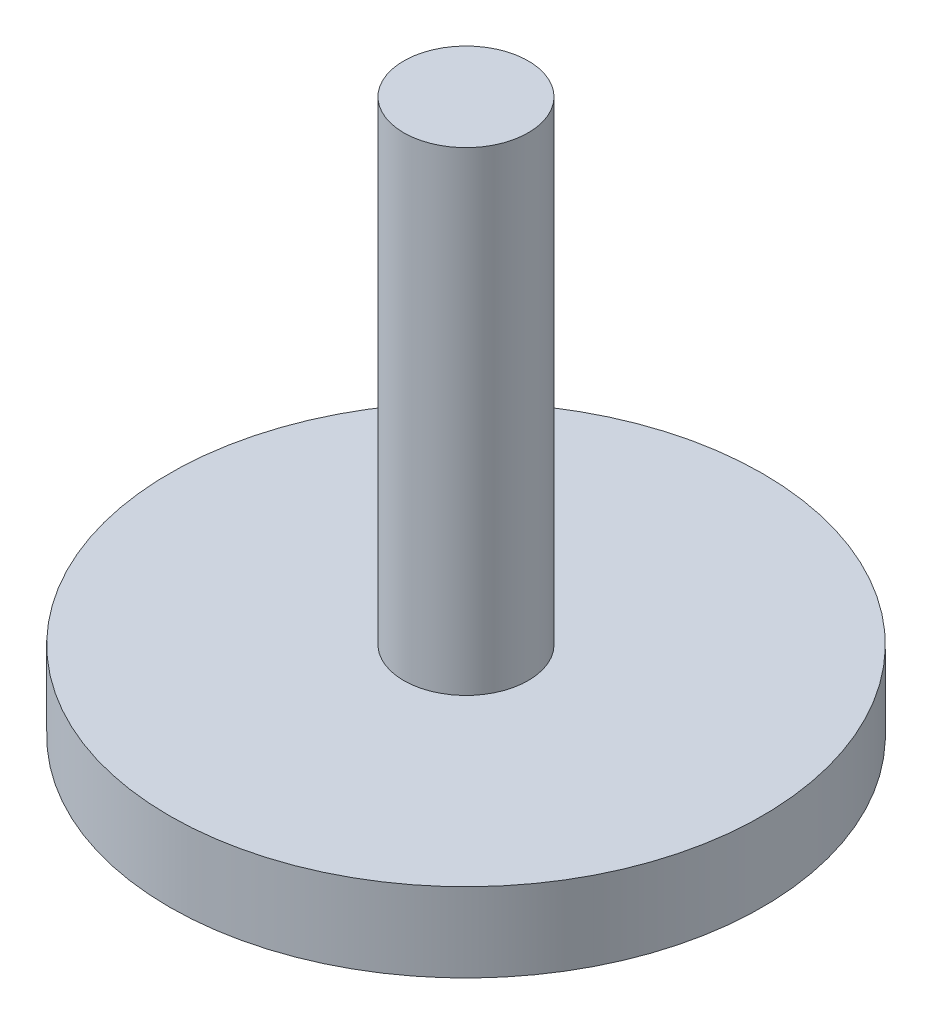
ISO-10303-21;
HEADER;
FILE_DESCRIPTION(('STEP AP214'),'2;1');
FILE_NAME('part.step','',(''),(''),'','','');
FILE_SCHEMA(('AUTOMOTIVE_DESIGN { 1 0 10303 214 1 1 1 1 }'));
ENDSEC;
DATA;
#1=APPLICATION_CONTEXT('core data for automotive mechanical design processes');
#2=APPLICATION_PROTOCOL_DEFINITION('international standard','automotive_design',2000,#1);
#3=PRODUCT_CONTEXT('',#1,'mechanical');
#4=PRODUCT('Part','Part','',(#3));
#5=PRODUCT_RELATED_PRODUCT_CATEGORY('part','',(#4));
#6=PRODUCT_DEFINITION_FORMATION('','',#4);
#7=PRODUCT_DEFINITION_CONTEXT('part definition',#1,'design');
#8=PRODUCT_DEFINITION('design','',#6,#7);
#9=PRODUCT_DEFINITION_SHAPE('','',#8);
#10=(LENGTH_UNIT() NAMED_UNIT(*) SI_UNIT(.MILLI.,.METRE.));
#11=(NAMED_UNIT(*) PLANE_ANGLE_UNIT() SI_UNIT($,.RADIAN.));
#12=(NAMED_UNIT(*) SI_UNIT($,.STERADIAN.) SOLID_ANGLE_UNIT());
#13=UNCERTAINTY_MEASURE_WITH_UNIT(LENGTH_MEASURE(1.E-05),#10,'distance_accuracy_value','');
#14=(GEOMETRIC_REPRESENTATION_CONTEXT(3) GLOBAL_UNCERTAINTY_ASSIGNED_CONTEXT((#13)) GLOBAL_UNIT_ASSIGNED_CONTEXT((#10,
#11,#12)) REPRESENTATION_CONTEXT('',''));
#15=CARTESIAN_POINT('',(0.,0.,0.));
#16=DIRECTION('',(0.,0.,1.));
#17=DIRECTION('',(1.,0.,0.));
#18=AXIS2_PLACEMENT_3D('',#15,#16,#17);
#19=CARTESIAN_POINT('',(0.,2.,0.));
#20=DIRECTION('',(0.,-1.,0.));
#21=DIRECTION('',(0.,0.,-1.));
#22=AXIS2_PLACEMENT_3D('',#19,#20,#21);
#23=CYLINDRICAL_SURFACE('',#22,7.5);
#24=CARTESIAN_POINT('',(0.,2.,0.));
#25=DIRECTION('',(0.,1.,0.));
#26=DIRECTION('',(0.,0.,1.));
#27=AXIS2_PLACEMENT_3D('',#24,#25,#26);
#28=CIRCLE('',#27,7.5);
#29=CARTESIAN_POINT('',(0.,2.,7.5));
#30=VERTEX_POINT('',#29);
#31=EDGE_CURVE('E38',#30,#30,#28,.T.);
#32=ORIENTED_EDGE('',*,*,#31,.F.);
#33=EDGE_LOOP('',(#32));
#34=FACE_BOUND('',#33,.T.);
#35=CARTESIAN_POINT('',(0.,0.,0.));
#36=DIRECTION('',(0.,1.,0.));
#37=DIRECTION('',(0.,0.,1.));
#38=AXIS2_PLACEMENT_3D('',#35,#36,#37);
#39=CIRCLE('',#38,7.5);
#40=CARTESIAN_POINT('',(0.,0.,7.5));
#41=VERTEX_POINT('',#40);
#42=EDGE_CURVE('E34',#41,#41,#39,.T.);
#43=ORIENTED_EDGE('',*,*,#42,.T.);
#44=EDGE_LOOP('',(#43));
#45=FACE_BOUND('',#44,.T.);
#46=ADVANCED_FACE('F31',(#34,#45),#23,.T.);
#47=CARTESIAN_POINT('',(0.,2.,0.));
#48=DIRECTION('',(0.,1.,0.));
#49=DIRECTION('',(0.,0.,1.));
#50=AXIS2_PLACEMENT_3D('',#47,#48,#49);
#51=PLANE('',#50);
#52=CARTESIAN_POINT('',(0.,2.,0.));
#53=DIRECTION('',(0.,1.,0.));
#54=DIRECTION('',(0.,0.,1.));
#55=AXIS2_PLACEMENT_3D('',#52,#53,#54);
#56=CIRCLE('',#55,1.575);
#57=CARTESIAN_POINT('',(0.,2.,1.575));
#58=VERTEX_POINT('',#57);
#59=EDGE_CURVE('E10',#58,#58,#56,.T.);
#60=ORIENTED_EDGE('',*,*,#59,.F.);
#61=EDGE_LOOP('',(#60));
#62=FACE_BOUND('',#61,.T.);
#63=ORIENTED_EDGE('',*,*,#31,.T.);
#64=EDGE_LOOP('',(#63));
#65=FACE_BOUND('',#64,.T.);
#66=ADVANCED_FACE('F55',(#62,#65),#51,.T.);
#67=CARTESIAN_POINT('',(0.,0.,0.));
#68=DIRECTION('',(0.,1.,0.));
#69=DIRECTION('',(0.,0.,1.));
#70=AXIS2_PLACEMENT_3D('',#67,#68,#69);
#71=PLANE('',#70);
#72=ORIENTED_EDGE('',*,*,#42,.F.);
#73=EDGE_LOOP('',(#72));
#74=FACE_BOUND('',#73,.T.);
#75=ADVANCED_FACE('F52',(#74),#71,.F.);
#76=CARTESIAN_POINT('',(0.,14.,0.));
#77=DIRECTION('',(0.,-1.,0.));
#78=DIRECTION('',(0.,0.,-1.));
#79=AXIS2_PLACEMENT_3D('',#76,#77,#78);
#80=CYLINDRICAL_SURFACE('',#79,1.575);
#81=CARTESIAN_POINT('',(0.,14.,0.));
#82=DIRECTION('',(0.,1.,0.));
#83=DIRECTION('',(0.,0.,1.));
#84=AXIS2_PLACEMENT_3D('',#81,#82,#83);
#85=CIRCLE('',#84,1.575);
#86=CARTESIAN_POINT('',(0.,14.,1.575));
#87=VERTEX_POINT('',#86);
#88=EDGE_CURVE('E44',#87,#87,#85,.T.);
#89=ORIENTED_EDGE('',*,*,#88,.F.);
#90=EDGE_LOOP('',(#89));
#91=FACE_BOUND('',#90,.T.);
#92=ORIENTED_EDGE('',*,*,#59,.T.);
#93=EDGE_LOOP('',(#92));
#94=FACE_BOUND('',#93,.T.);
#95=ADVANCED_FACE('F54',(#91,#94),#80,.T.);
#96=CARTESIAN_POINT('',(0.,14.,0.));
#97=DIRECTION('',(0.,1.,0.));
#98=DIRECTION('',(0.,0.,1.));
#99=AXIS2_PLACEMENT_3D('',#96,#97,#98);
#100=PLANE('',#99);
#101=ORIENTED_EDGE('',*,*,#88,.T.);
#102=EDGE_LOOP('',(#101));
#103=FACE_BOUND('',#102,.T.);
#104=ADVANCED_FACE('F60',(#103),#100,.T.);
#105=CLOSED_SHELL('',(#46,#66,#75,#95,#104));
#106=MANIFOLD_SOLID_BREP('B2',#105);
#107=ADVANCED_BREP_SHAPE_REPRESENTATION('',(#18,#106),#14);
#108=SHAPE_DEFINITION_REPRESENTATION(#9,#107);
ENDSEC;
END-ISO-10303-21;
